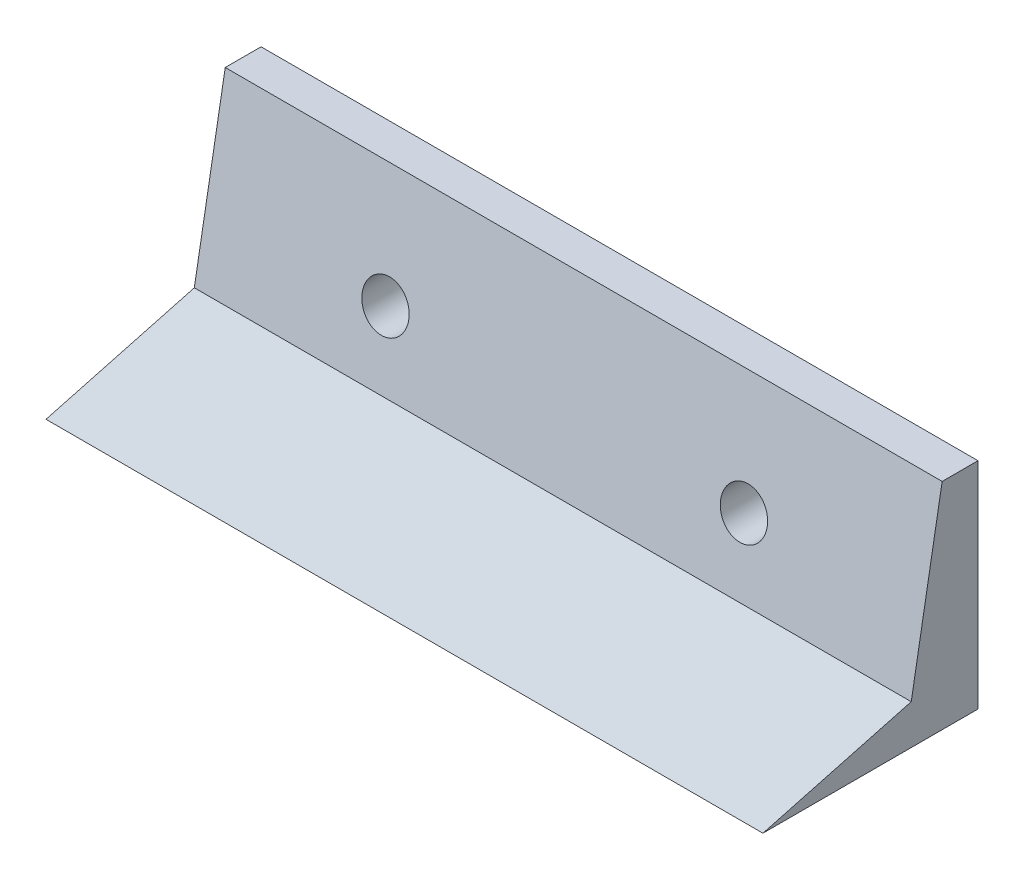
ISO-10303-21;
HEADER;
FILE_DESCRIPTION(('STEP AP214'),'2;1');
FILE_NAME('part.step','',(''),(''),'','','');
FILE_SCHEMA(('AUTOMOTIVE_DESIGN { 1 0 10303 214 1 1 1 1 }'));
ENDSEC;
DATA;
#1=APPLICATION_CONTEXT('core data for automotive mechanical design processes');
#2=APPLICATION_PROTOCOL_DEFINITION('international standard','automotive_design',2000,#1);
#3=PRODUCT_CONTEXT('',#1,'mechanical');
#4=PRODUCT('Part','Part','',(#3));
#5=PRODUCT_RELATED_PRODUCT_CATEGORY('part','',(#4));
#6=PRODUCT_DEFINITION_FORMATION('','',#4);
#7=PRODUCT_DEFINITION_CONTEXT('part definition',#1,'design');
#8=PRODUCT_DEFINITION('design','',#6,#7);
#9=PRODUCT_DEFINITION_SHAPE('','',#8);
#10=(LENGTH_UNIT() NAMED_UNIT(*) SI_UNIT(.MILLI.,.METRE.));
#11=(NAMED_UNIT(*) PLANE_ANGLE_UNIT() SI_UNIT($,.RADIAN.));
#12=(NAMED_UNIT(*) SI_UNIT($,.STERADIAN.) SOLID_ANGLE_UNIT());
#13=UNCERTAINTY_MEASURE_WITH_UNIT(LENGTH_MEASURE(1.E-05),#10,'distance_accuracy_value','');
#14=(GEOMETRIC_REPRESENTATION_CONTEXT(3) GLOBAL_UNCERTAINTY_ASSIGNED_CONTEXT((#13)) GLOBAL_UNIT_ASSIGNED_CONTEXT((#10,
#11,#12)) REPRESENTATION_CONTEXT('',''));
#15=CARTESIAN_POINT('',(0.,0.,0.));
#16=DIRECTION('',(0.,0.,1.));
#17=DIRECTION('',(1.,0.,0.));
#18=AXIS2_PLACEMENT_3D('',#15,#16,#17);
#19=CARTESIAN_POINT('',(100.,0.,30.));
#20=DIRECTION('',(0.,1.,0.));
#21=DIRECTION('',(0.,0.,1.));
#22=AXIS2_PLACEMENT_3D('',#19,#20,#21);
#23=PLANE('',#22);
#24=DIRECTION('',(0.,0.,-1.));
#25=VECTOR('',#24,1.);
#26=CARTESIAN_POINT('',(0.,0.,30.));
#27=LINE('',#26,#25);
#28=CARTESIAN_POINT('',(0.,0.,30.));
#29=VERTEX_POINT('',#28);
#30=CARTESIAN_POINT('',(0.,0.,0.));
#31=VERTEX_POINT('',#30);
#32=EDGE_CURVE('E126',#29,#31,#27,.T.);
#33=ORIENTED_EDGE('',*,*,#32,.T.);
#34=DIRECTION('',(-1.,0.,0.));
#35=VECTOR('',#34,1.);
#36=CARTESIAN_POINT('',(100.,0.,0.));
#37=LINE('',#36,#35);
#38=CARTESIAN_POINT('',(100.,0.,0.));
#39=VERTEX_POINT('',#38);
#40=EDGE_CURVE('E11',#39,#31,#37,.T.);
#41=ORIENTED_EDGE('',*,*,#40,.F.);
#42=DIRECTION('',(0.,0.,-1.));
#43=VECTOR('',#42,1.);
#44=CARTESIAN_POINT('',(100.,0.,30.));
#45=LINE('',#44,#43);
#46=CARTESIAN_POINT('',(100.,0.,30.));
#47=VERTEX_POINT('',#46);
#48=EDGE_CURVE('E140',#47,#39,#45,.T.);
#49=ORIENTED_EDGE('',*,*,#48,.F.);
#50=DIRECTION('',(-1.,0.,0.));
#51=VECTOR('',#50,1.);
#52=CARTESIAN_POINT('',(100.,0.,30.));
#53=LINE('',#52,#51);
#54=EDGE_CURVE('E122',#47,#29,#53,.T.);
#55=ORIENTED_EDGE('',*,*,#54,.T.);
#56=EDGE_LOOP('',(#33,#41,#49,#55));
#57=FACE_BOUND('',#56,.T.);
#58=ADVANCED_FACE('F45',(#57),#23,.F.);
#59=CARTESIAN_POINT('',(100.,0.,0.));
#60=DIRECTION('',(0.,0.,1.));
#61=DIRECTION('',(1.,0.,0.));
#62=AXIS2_PLACEMENT_3D('',#59,#60,#61);
#63=PLANE('',#62);
#64=CARTESIAN_POINT('',(75.,15.,0.));
#65=DIRECTION('',(0.,0.,-1.));
#66=DIRECTION('',(-1.,0.,0.));
#67=AXIS2_PLACEMENT_3D('',#64,#65,#66);
#68=CIRCLE('',#67,1.69999999999999);
#69=CARTESIAN_POINT('',(73.3,15.,0.));
#70=VERTEX_POINT('',#69);
#71=EDGE_CURVE('E162',#70,#70,#68,.T.);
#72=ORIENTED_EDGE('',*,*,#71,.F.);
#73=EDGE_LOOP('',(#72));
#74=FACE_BOUND('',#73,.T.);
#75=CARTESIAN_POINT('',(25.,15.,0.));
#76=DIRECTION('',(0.,0.,-1.));
#77=DIRECTION('',(-1.,0.,0.));
#78=AXIS2_PLACEMENT_3D('',#75,#76,#77);
#79=CIRCLE('',#78,1.7);
#80=CARTESIAN_POINT('',(23.3,15.,0.));
#81=VERTEX_POINT('',#80);
#82=EDGE_CURVE('E131',#81,#81,#79,.T.);
#83=ORIENTED_EDGE('',*,*,#82,.F.);
#84=EDGE_LOOP('',(#83));
#85=FACE_BOUND('',#84,.T.);
#86=DIRECTION('',(0.,1.,0.));
#87=VECTOR('',#86,1.);
#88=CARTESIAN_POINT('',(0.,0.,0.));
#89=LINE('',#88,#87);
#90=CARTESIAN_POINT('',(0.,30.,0.));
#91=VERTEX_POINT('',#90);
#92=EDGE_CURVE('E130',#31,#91,#89,.T.);
#93=ORIENTED_EDGE('',*,*,#92,.T.);
#94=DIRECTION('',(-1.,0.,0.));
#95=VECTOR('',#94,1.);
#96=CARTESIAN_POINT('',(100.,30.,0.));
#97=LINE('',#96,#95);
#98=CARTESIAN_POINT('',(100.,30.,0.));
#99=VERTEX_POINT('',#98);
#100=EDGE_CURVE('E55',#99,#91,#97,.T.);
#101=ORIENTED_EDGE('',*,*,#100,.F.);
#102=DIRECTION('',(0.,1.,0.));
#103=VECTOR('',#102,1.);
#104=CARTESIAN_POINT('',(100.,0.,0.));
#105=LINE('',#104,#103);
#106=EDGE_CURVE('E98',#39,#99,#105,.T.);
#107=ORIENTED_EDGE('',*,*,#106,.F.);
#108=ORIENTED_EDGE('',*,*,#40,.T.);
#109=EDGE_LOOP('',(#93,#101,#107,#108));
#110=FACE_BOUND('',#109,.T.);
#111=ADVANCED_FACE('F183',(#74,#85,#110),#63,.F.);
#112=CARTESIAN_POINT('',(100.,30.,5.));
#113=DIRECTION('',(0.,-1.,0.));
#114=DIRECTION('',(0.,0.,-1.));
#115=AXIS2_PLACEMENT_3D('',#112,#113,#114);
#116=PLANE('',#115);
#117=DIRECTION('',(0.,0.,1.));
#118=VECTOR('',#117,1.);
#119=CARTESIAN_POINT('',(0.,30.,5.));
#120=LINE('',#119,#118);
#121=CARTESIAN_POINT('',(0.,30.,5.));
#122=VERTEX_POINT('',#121);
#123=EDGE_CURVE('E114',#91,#122,#120,.T.);
#124=ORIENTED_EDGE('',*,*,#123,.T.);
#125=DIRECTION('',(-1.,0.,0.));
#126=VECTOR('',#125,1.);
#127=CARTESIAN_POINT('',(100.,30.,5.));
#128=LINE('',#127,#126);
#129=CARTESIAN_POINT('',(100.,30.,5.));
#130=VERTEX_POINT('',#129);
#131=EDGE_CURVE('E111',#130,#122,#128,.T.);
#132=ORIENTED_EDGE('',*,*,#131,.F.);
#133=DIRECTION('',(0.,0.,1.));
#134=VECTOR('',#133,1.);
#135=CARTESIAN_POINT('',(100.,30.,5.));
#136=LINE('',#135,#134);
#137=EDGE_CURVE('E102',#99,#130,#136,.T.);
#138=ORIENTED_EDGE('',*,*,#137,.F.);
#139=ORIENTED_EDGE('',*,*,#100,.T.);
#140=EDGE_LOOP('',(#124,#132,#138,#139));
#141=FACE_BOUND('',#140,.T.);
#142=ADVANCED_FACE('F112',(#141),#116,.F.);
#143=CARTESIAN_POINT('',(100.,5.5432287597402,9.31238863067264));
#144=DIRECTION('',(0.,-0.173648177666931,-0.984807753012208));
#145=DIRECTION('',(0.,0.984807753012208,-0.173648177666931));
#146=AXIS2_PLACEMENT_3D('',#143,#144,#145);
#147=PLANE('',#146);
#148=CARTESIAN_POINT('',(75.,15.,7.64490471062698));
#149=DIRECTION('',(0.,-0.173648177666931,-0.984807753012208));
#150=DIRECTION('',(0.,0.984807753012208,-0.173648177666931));
#151=AXIS2_PLACEMENT_3D('',#148,#149,#150);
#152=ELLIPSE('',#151,3.30013648862868,3.25000000000001);
#153=CARTESIAN_POINT('',(75.,18.25,7.07184202332447));
#154=VERTEX_POINT('',#153);
#155=EDGE_CURVE('E48',#154,#154,#152,.T.);
#156=ORIENTED_EDGE('',*,*,#155,.T.);
#157=EDGE_LOOP('',(#156));
#158=FACE_BOUND('',#157,.T.);
#159=CARTESIAN_POINT('',(25.,15.,7.64490471062698));
#160=DIRECTION('',(0.,-0.173648177666931,-0.984807753012208));
#161=DIRECTION('',(0.,0.984807753012208,-0.173648177666931));
#162=AXIS2_PLACEMENT_3D('',#159,#160,#161);
#163=ELLIPSE('',#162,3.30013648862867,3.25);
#164=CARTESIAN_POINT('',(25.,18.25,7.07184202332447));
#165=VERTEX_POINT('',#164);
#166=EDGE_CURVE('E155',#165,#165,#163,.T.);
#167=ORIENTED_EDGE('',*,*,#166,.T.);
#168=EDGE_LOOP('',(#167));
#169=FACE_BOUND('',#168,.T.);
#170=DIRECTION('',(0.,-0.984807753012208,0.173648177666931));
#171=VECTOR('',#170,1.);
#172=CARTESIAN_POINT('',(0.,5.5432287597402,9.31238863067264));
#173=LINE('',#172,#171);
#174=CARTESIAN_POINT('',(0.,5.5432287597402,9.31238863067264));
#175=VERTEX_POINT('',#174);
#176=EDGE_CURVE('E84',#122,#175,#173,.T.);
#177=ORIENTED_EDGE('',*,*,#176,.T.);
#178=DIRECTION('',(-1.,0.,0.));
#179=VECTOR('',#178,1.);
#180=CARTESIAN_POINT('',(100.,5.5432287597402,9.31238863067264));
#181=LINE('',#180,#179);
#182=CARTESIAN_POINT('',(100.,5.5432287597402,9.31238863067264));
#183=VERTEX_POINT('',#182);
#184=EDGE_CURVE('E116',#183,#175,#181,.T.);
#185=ORIENTED_EDGE('',*,*,#184,.F.);
#186=DIRECTION('',(0.,-0.984807753012208,0.173648177666931));
#187=VECTOR('',#186,1.);
#188=CARTESIAN_POINT('',(100.,5.5432287597402,9.31238863067264));
#189=LINE('',#188,#187);
#190=EDGE_CURVE('E106',#130,#183,#189,.T.);
#191=ORIENTED_EDGE('',*,*,#190,.F.);
#192=ORIENTED_EDGE('',*,*,#131,.T.);
#193=EDGE_LOOP('',(#177,#185,#191,#192));
#194=FACE_BOUND('',#193,.T.);
#195=ADVANCED_FACE('F118',(#158,#169,#194),#147,.F.);
#196=CARTESIAN_POINT('',(100.,0.,30.));
#197=DIRECTION('',(0.,-0.965925826289068,-0.258819045102522));
#198=DIRECTION('',(0.,0.258819045102522,-0.965925826289068));
#199=AXIS2_PLACEMENT_3D('',#196,#197,#198);
#200=PLANE('',#199);
#201=DIRECTION('',(0.,-0.258819045102522,0.965925826289068));
#202=VECTOR('',#201,1.);
#203=CARTESIAN_POINT('',(0.,0.,30.));
#204=LINE('',#203,#202);
#205=EDGE_CURVE('E90',#175,#29,#204,.T.);
#206=ORIENTED_EDGE('',*,*,#205,.T.);
#207=ORIENTED_EDGE('',*,*,#54,.F.);
#208=DIRECTION('',(0.,-0.258819045102522,0.965925826289068));
#209=VECTOR('',#208,1.);
#210=CARTESIAN_POINT('',(100.,0.,30.));
#211=LINE('',#210,#209);
#212=EDGE_CURVE('E64',#183,#47,#211,.T.);
#213=ORIENTED_EDGE('',*,*,#212,.F.);
#214=ORIENTED_EDGE('',*,*,#184,.T.);
#215=EDGE_LOOP('',(#206,#207,#213,#214));
#216=FACE_BOUND('',#215,.T.);
#217=ADVANCED_FACE('F197',(#216),#200,.F.);
#218=CARTESIAN_POINT('',(100.,0.,0.));
#219=DIRECTION('',(1.,0.,0.));
#220=DIRECTION('',(0.,0.,-1.));
#221=AXIS2_PLACEMENT_3D('',#218,#219,#220);
#222=PLANE('',#221);
#223=ORIENTED_EDGE('',*,*,#48,.T.);
#224=ORIENTED_EDGE('',*,*,#106,.T.);
#225=ORIENTED_EDGE('',*,*,#137,.T.);
#226=ORIENTED_EDGE('',*,*,#190,.T.);
#227=ORIENTED_EDGE('',*,*,#212,.T.);
#228=EDGE_LOOP('',(#223,#224,#225,#226,#227));
#229=FACE_BOUND('',#228,.T.);
#230=ADVANCED_FACE('F104',(#229),#222,.T.);
#231=CARTESIAN_POINT('',(0.,0.,0.));
#232=DIRECTION('',(1.,0.,0.));
#233=DIRECTION('',(0.,0.,-1.));
#234=AXIS2_PLACEMENT_3D('',#231,#232,#233);
#235=PLANE('',#234);
#236=ORIENTED_EDGE('',*,*,#32,.F.);
#237=ORIENTED_EDGE('',*,*,#205,.F.);
#238=ORIENTED_EDGE('',*,*,#176,.F.);
#239=ORIENTED_EDGE('',*,*,#123,.F.);
#240=ORIENTED_EDGE('',*,*,#92,.F.);
#241=EDGE_LOOP('',(#236,#237,#238,#239,#240));
#242=FACE_BOUND('',#241,.T.);
#243=ADVANCED_FACE('F185',(#242),#235,.F.);
#244=CARTESIAN_POINT('',(25.,15.,0.));
#245=DIRECTION('',(0.,0.,-1.));
#246=DIRECTION('',(-1.,0.,0.));
#247=AXIS2_PLACEMENT_3D('',#244,#245,#246);
#248=CYLINDRICAL_SURFACE('',#247,1.69999999999999);
#249=CARTESIAN_POINT('',(25.,15.,2.5));
#250=DIRECTION('',(0.,0.,-1.));
#251=DIRECTION('',(-1.,0.,0.));
#252=AXIS2_PLACEMENT_3D('',#249,#250,#251);
#253=CIRCLE('',#252,1.69999999999999);
#254=CARTESIAN_POINT('',(23.3,15.,2.5));
#255=VERTEX_POINT('',#254);
#256=EDGE_CURVE('E151',#255,#255,#253,.F.);
#257=ORIENTED_EDGE('',*,*,#256,.T.);
#258=EDGE_LOOP('',(#257));
#259=FACE_BOUND('',#258,.T.);
#260=ORIENTED_EDGE('',*,*,#82,.T.);
#261=EDGE_LOOP('',(#260));
#262=FACE_BOUND('',#261,.T.);
#263=ADVANCED_FACE('F187',(#259,#262),#248,.F.);
#264=CARTESIAN_POINT('',(75.,15.,0.));
#265=DIRECTION('',(0.,0.,-1.));
#266=DIRECTION('',(-1.,0.,0.));
#267=AXIS2_PLACEMENT_3D('',#264,#265,#266);
#268=CYLINDRICAL_SURFACE('',#267,1.69999999999999);
#269=CARTESIAN_POINT('',(75.,15.,2.5));
#270=DIRECTION('',(0.,0.,-1.));
#271=DIRECTION('',(-1.,0.,0.));
#272=AXIS2_PLACEMENT_3D('',#269,#270,#271);
#273=CIRCLE('',#272,1.69999999999999);
#274=CARTESIAN_POINT('',(73.3,15.,2.5));
#275=VERTEX_POINT('',#274);
#276=EDGE_CURVE('E147',#275,#275,#273,.F.);
#277=ORIENTED_EDGE('',*,*,#276,.T.);
#278=EDGE_LOOP('',(#277));
#279=FACE_BOUND('',#278,.T.);
#280=ORIENTED_EDGE('',*,*,#71,.T.);
#281=EDGE_LOOP('',(#280));
#282=FACE_BOUND('',#281,.T.);
#283=ADVANCED_FACE('F194',(#279,#282),#268,.F.);
#284=CARTESIAN_POINT('',(75.,15.,30.));
#285=DIRECTION('',(0.,0.,-1.));
#286=DIRECTION('',(-1.,0.,0.));
#287=AXIS2_PLACEMENT_3D('',#284,#285,#286);
#288=CYLINDRICAL_SURFACE('',#287,3.25000000000001);
#289=CARTESIAN_POINT('',(75.,15.,2.5));
#290=DIRECTION('',(0.,0.,-1.));
#291=DIRECTION('',(-1.,0.,0.));
#292=AXIS2_PLACEMENT_3D('',#289,#290,#291);
#293=CIRCLE('',#292,3.25000000000001);
#294=CARTESIAN_POINT('',(71.75,15.,2.5));
#295=VERTEX_POINT('',#294);
#296=EDGE_CURVE('E152',#295,#295,#293,.T.);
#297=ORIENTED_EDGE('',*,*,#296,.T.);
#298=EDGE_LOOP('',(#297));
#299=FACE_BOUND('',#298,.T.);
#300=ORIENTED_EDGE('',*,*,#155,.F.);
#301=EDGE_LOOP('',(#300));
#302=FACE_BOUND('',#301,.T.);
#303=ADVANCED_FACE('F242',(#299,#302),#288,.F.);
#304=CARTESIAN_POINT('',(75.,15.,2.5));
#305=DIRECTION('',(0.,0.,-1.));
#306=DIRECTION('',(-1.,0.,0.));
#307=AXIS2_PLACEMENT_3D('',#304,#305,#306);
#308=PLANE('',#307);
#309=ORIENTED_EDGE('',*,*,#296,.F.);
#310=EDGE_LOOP('',(#309));
#311=FACE_BOUND('',#310,.T.);
#312=ORIENTED_EDGE('',*,*,#276,.F.);
#313=EDGE_LOOP('',(#312));
#314=FACE_BOUND('',#313,.T.);
#315=ADVANCED_FACE('F252',(#311,#314),#308,.F.);
#316=CARTESIAN_POINT('',(25.,15.,30.));
#317=DIRECTION('',(0.,0.,-1.));
#318=DIRECTION('',(-1.,0.,0.));
#319=AXIS2_PLACEMENT_3D('',#316,#317,#318);
#320=CYLINDRICAL_SURFACE('',#319,3.25);
#321=CARTESIAN_POINT('',(25.,15.,2.5));
#322=DIRECTION('',(0.,0.,-1.));
#323=DIRECTION('',(-1.,0.,0.));
#324=AXIS2_PLACEMENT_3D('',#321,#322,#323);
#325=CIRCLE('',#324,3.25);
#326=CARTESIAN_POINT('',(21.75,15.,2.5));
#327=VERTEX_POINT('',#326);
#328=EDGE_CURVE('E174',#327,#327,#325,.T.);
#329=ORIENTED_EDGE('',*,*,#328,.T.);
#330=EDGE_LOOP('',(#329));
#331=FACE_BOUND('',#330,.T.);
#332=ORIENTED_EDGE('',*,*,#166,.F.);
#333=EDGE_LOOP('',(#332));
#334=FACE_BOUND('',#333,.T.);
#335=ADVANCED_FACE('F262',(#331,#334),#320,.F.);
#336=CARTESIAN_POINT('',(25.,15.,2.5));
#337=DIRECTION('',(0.,0.,-1.));
#338=DIRECTION('',(-1.,0.,0.));
#339=AXIS2_PLACEMENT_3D('',#336,#337,#338);
#340=PLANE('',#339);
#341=ORIENTED_EDGE('',*,*,#328,.F.);
#342=EDGE_LOOP('',(#341));
#343=FACE_BOUND('',#342,.T.);
#344=ORIENTED_EDGE('',*,*,#256,.F.);
#345=EDGE_LOOP('',(#344));
#346=FACE_BOUND('',#345,.T.);
#347=ADVANCED_FACE('F272',(#343,#346),#340,.F.);
#348=CLOSED_SHELL('',(#58,#111,#142,#195,#217,#230,#243,#263,#283,#303,#315,#335,#347));
#349=MANIFOLD_SOLID_BREP('B2',#348);
#350=ADVANCED_BREP_SHAPE_REPRESENTATION('',(#18,#349),#14);
#351=SHAPE_DEFINITION_REPRESENTATION(#9,#350);
ENDSEC;
END-ISO-10303-21;
